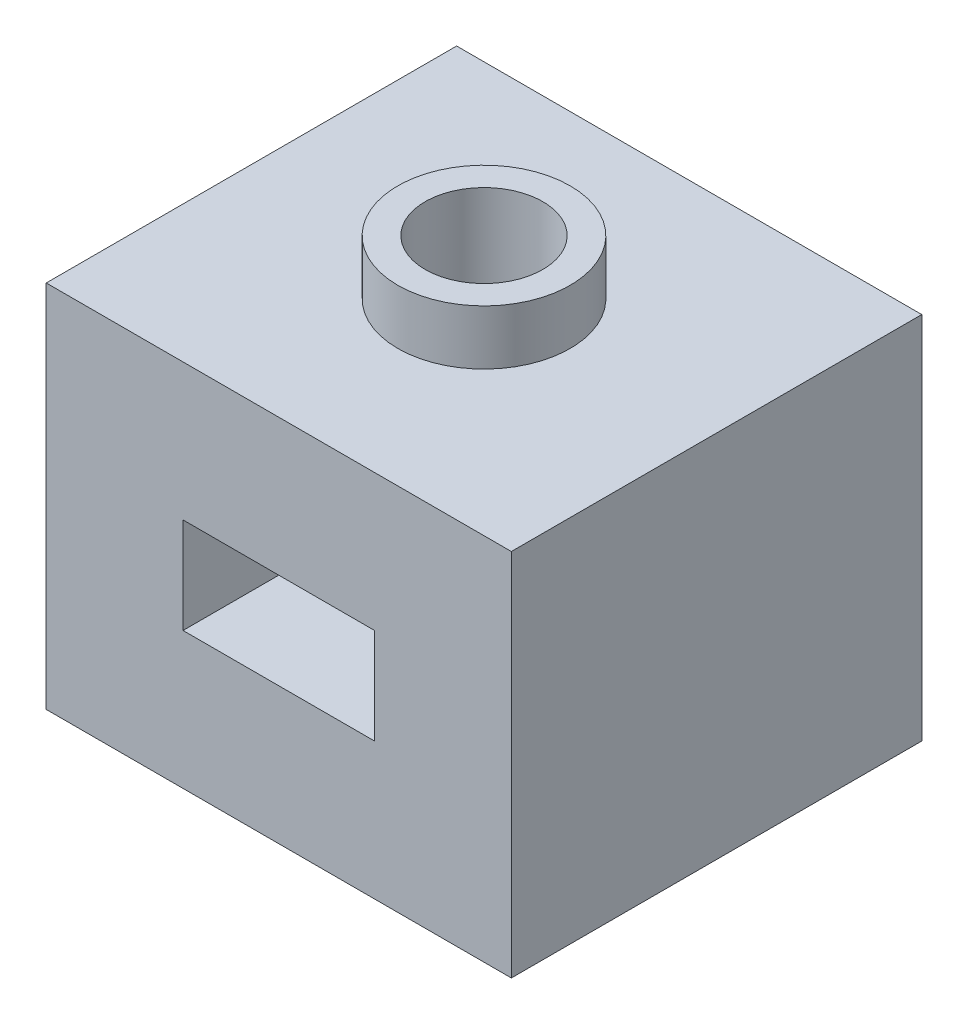
ISO-10303-21;
HEADER;
FILE_DESCRIPTION(('STEP AP214'),'2;1');
FILE_NAME('part.step','',(''),(''),'','','');
FILE_SCHEMA(('AUTOMOTIVE_DESIGN { 1 0 10303 214 1 1 1 1 }'));
ENDSEC;
DATA;
#1=APPLICATION_CONTEXT('core data for automotive mechanical design processes');
#2=APPLICATION_PROTOCOL_DEFINITION('international standard','automotive_design',2000,#1);
#3=PRODUCT_CONTEXT('',#1,'mechanical');
#4=PRODUCT('Part','Part','',(#3));
#5=PRODUCT_RELATED_PRODUCT_CATEGORY('part','',(#4));
#6=PRODUCT_DEFINITION_FORMATION('','',#4);
#7=PRODUCT_DEFINITION_CONTEXT('part definition',#1,'design');
#8=PRODUCT_DEFINITION('design','',#6,#7);
#9=PRODUCT_DEFINITION_SHAPE('','',#8);
#10=(LENGTH_UNIT() NAMED_UNIT(*) SI_UNIT(.MILLI.,.METRE.));
#11=(NAMED_UNIT(*) PLANE_ANGLE_UNIT() SI_UNIT($,.RADIAN.));
#12=(NAMED_UNIT(*) SI_UNIT($,.STERADIAN.) SOLID_ANGLE_UNIT());
#13=UNCERTAINTY_MEASURE_WITH_UNIT(LENGTH_MEASURE(1.E-05),#10,'distance_accuracy_value','');
#14=(GEOMETRIC_REPRESENTATION_CONTEXT(3) GLOBAL_UNCERTAINTY_ASSIGNED_CONTEXT((#13)) GLOBAL_UNIT_ASSIGNED_CONTEXT((#10,
#11,#12)) REPRESENTATION_CONTEXT('',''));
#15=CARTESIAN_POINT('',(0.,0.,0.));
#16=DIRECTION('',(0.,0.,1.));
#17=DIRECTION('',(1.,0.,0.));
#18=AXIS2_PLACEMENT_3D('',#15,#16,#17);
#19=CARTESIAN_POINT('',(0.,0.,15.));
#20=DIRECTION('',(0.,0.,-1.));
#21=DIRECTION('',(-1.,0.,0.));
#22=AXIS2_PLACEMENT_3D('',#19,#20,#21);
#23=PLANE('',#22);
#24=DIRECTION('',(-1.,0.,0.));
#25=VECTOR('',#24,1.);
#26=CARTESIAN_POINT('',(-8.5,6.75,15.));
#27=LINE('',#26,#25);
#28=CARTESIAN_POINT('',(8.5,6.75,15.));
#29=VERTEX_POINT('',#28);
#30=CARTESIAN_POINT('',(-8.5,6.75,15.));
#31=VERTEX_POINT('',#30);
#32=EDGE_CURVE('E163',#29,#31,#27,.T.);
#33=ORIENTED_EDGE('',*,*,#32,.T.);
#34=DIRECTION('',(0.,-1.,0.));
#35=VECTOR('',#34,1.);
#36=CARTESIAN_POINT('',(-8.5,6.75,15.));
#37=LINE('',#36,#35);
#38=CARTESIAN_POINT('',(-8.5,-6.75,15.));
#39=VERTEX_POINT('',#38);
#40=EDGE_CURVE('E167',#31,#39,#37,.T.);
#41=ORIENTED_EDGE('',*,*,#40,.T.);
#42=DIRECTION('',(1.,0.,0.));
#43=VECTOR('',#42,1.);
#44=CARTESIAN_POINT('',(-8.5,-6.75,15.));
#45=LINE('',#44,#43);
#46=CARTESIAN_POINT('',(8.5,-6.75,15.));
#47=VERTEX_POINT('',#46);
#48=EDGE_CURVE('E171',#39,#47,#45,.T.);
#49=ORIENTED_EDGE('',*,*,#48,.T.);
#50=DIRECTION('',(0.,1.,0.));
#51=VECTOR('',#50,1.);
#52=CARTESIAN_POINT('',(8.5,6.75,15.));
#53=LINE('',#52,#51);
#54=EDGE_CURVE('E174',#47,#29,#53,.T.);
#55=ORIENTED_EDGE('',*,*,#54,.T.);
#56=EDGE_LOOP('',(#33,#41,#49,#55));
#57=FACE_BOUND('',#56,.T.);
#58=DIRECTION('',(0.,1.,0.));
#59=VECTOR('',#58,1.);
#60=CARTESIAN_POINT('',(3.5,1.75,15.));
#61=LINE('',#60,#59);
#62=CARTESIAN_POINT('',(3.5,-1.75,15.));
#63=VERTEX_POINT('',#62);
#64=CARTESIAN_POINT('',(3.5,1.75,15.));
#65=VERTEX_POINT('',#64);
#66=EDGE_CURVE('E113',#63,#65,#61,.T.);
#67=ORIENTED_EDGE('',*,*,#66,.F.);
#68=DIRECTION('',(1.,0.,0.));
#69=VECTOR('',#68,1.);
#70=CARTESIAN_POINT('',(-3.5,-1.75,15.));
#71=LINE('',#70,#69);
#72=CARTESIAN_POINT('',(-3.5,-1.75,15.));
#73=VERTEX_POINT('',#72);
#74=EDGE_CURVE('E139',#73,#63,#71,.T.);
#75=ORIENTED_EDGE('',*,*,#74,.F.);
#76=DIRECTION('',(0.,-1.,0.));
#77=VECTOR('',#76,1.);
#78=CARTESIAN_POINT('',(-3.5,1.75,15.));
#79=LINE('',#78,#77);
#80=CARTESIAN_POINT('',(-3.5,1.75,15.));
#81=VERTEX_POINT('',#80);
#82=EDGE_CURVE('E135',#81,#73,#79,.T.);
#83=ORIENTED_EDGE('',*,*,#82,.F.);
#84=DIRECTION('',(-1.,0.,0.));
#85=VECTOR('',#84,1.);
#86=CARTESIAN_POINT('',(-3.5,1.75,15.));
#87=LINE('',#86,#85);
#88=EDGE_CURVE('E122',#65,#81,#87,.T.);
#89=ORIENTED_EDGE('',*,*,#88,.F.);
#90=EDGE_LOOP('',(#67,#75,#83,#89));
#91=FACE_BOUND('',#90,.T.);
#92=ADVANCED_FACE('F47',(#57,#91),#23,.F.);
#93=CARTESIAN_POINT('',(0.,0.,0.));
#94=DIRECTION('',(0.,0.,-1.));
#95=DIRECTION('',(-1.,0.,0.));
#96=AXIS2_PLACEMENT_3D('',#93,#94,#95);
#97=PLANE('',#96);
#98=DIRECTION('',(-1.,0.,0.));
#99=VECTOR('',#98,1.);
#100=CARTESIAN_POINT('',(-8.5,6.75,0.));
#101=LINE('',#100,#99);
#102=CARTESIAN_POINT('',(8.5,6.75,0.));
#103=VERTEX_POINT('',#102);
#104=CARTESIAN_POINT('',(-8.5,6.75,0.));
#105=VERTEX_POINT('',#104);
#106=EDGE_CURVE('E131',#103,#105,#101,.T.);
#107=ORIENTED_EDGE('',*,*,#106,.F.);
#108=DIRECTION('',(0.,1.,0.));
#109=VECTOR('',#108,1.);
#110=CARTESIAN_POINT('',(8.5,6.75,0.));
#111=LINE('',#110,#109);
#112=CARTESIAN_POINT('',(8.5,-6.75,0.));
#113=VERTEX_POINT('',#112);
#114=EDGE_CURVE('E168',#113,#103,#111,.T.);
#115=ORIENTED_EDGE('',*,*,#114,.F.);
#116=DIRECTION('',(1.,0.,0.));
#117=VECTOR('',#116,1.);
#118=CARTESIAN_POINT('',(-8.5,-6.75,0.));
#119=LINE('',#118,#117);
#120=CARTESIAN_POINT('',(-8.5,-6.75,0.));
#121=VERTEX_POINT('',#120);
#122=EDGE_CURVE('E184',#121,#113,#119,.T.);
#123=ORIENTED_EDGE('',*,*,#122,.F.);
#124=DIRECTION('',(0.,-1.,0.));
#125=VECTOR('',#124,1.);
#126=CARTESIAN_POINT('',(-8.5,6.75,0.));
#127=LINE('',#126,#125);
#128=EDGE_CURVE('E181',#105,#121,#127,.T.);
#129=ORIENTED_EDGE('',*,*,#128,.F.);
#130=EDGE_LOOP('',(#107,#115,#123,#129));
#131=FACE_BOUND('',#130,.T.);
#132=DIRECTION('',(1.,0.,0.));
#133=VECTOR('',#132,1.);
#134=CARTESIAN_POINT('',(-3.5,-1.75,0.));
#135=LINE('',#134,#133);
#136=CARTESIAN_POINT('',(-3.5,-1.75,0.));
#137=VERTEX_POINT('',#136);
#138=CARTESIAN_POINT('',(3.5,-1.75,0.));
#139=VERTEX_POINT('',#138);
#140=EDGE_CURVE('E123',#137,#139,#135,.T.);
#141=ORIENTED_EDGE('',*,*,#140,.T.);
#142=DIRECTION('',(0.,1.,0.));
#143=VECTOR('',#142,1.);
#144=CARTESIAN_POINT('',(3.5,1.75,0.));
#145=LINE('',#144,#143);
#146=CARTESIAN_POINT('',(3.5,1.75,0.));
#147=VERTEX_POINT('',#146);
#148=EDGE_CURVE('E71',#139,#147,#145,.T.);
#149=ORIENTED_EDGE('',*,*,#148,.T.);
#150=DIRECTION('',(-1.,0.,0.));
#151=VECTOR('',#150,1.);
#152=CARTESIAN_POINT('',(-3.5,1.75,0.));
#153=LINE('',#152,#151);
#154=CARTESIAN_POINT('',(-3.5,1.75,0.));
#155=VERTEX_POINT('',#154);
#156=EDGE_CURVE('E129',#147,#155,#153,.T.);
#157=ORIENTED_EDGE('',*,*,#156,.T.);
#158=DIRECTION('',(0.,-1.,0.));
#159=VECTOR('',#158,1.);
#160=CARTESIAN_POINT('',(-3.5,1.75,0.));
#161=LINE('',#160,#159);
#162=EDGE_CURVE('E150',#155,#137,#161,.T.);
#163=ORIENTED_EDGE('',*,*,#162,.T.);
#164=EDGE_LOOP('',(#141,#149,#157,#163));
#165=FACE_BOUND('',#164,.T.);
#166=ADVANCED_FACE('F244',(#131,#165),#97,.T.);
#167=CARTESIAN_POINT('',(-8.5,6.75,15.));
#168=DIRECTION('',(0.,-1.,0.));
#169=DIRECTION('',(0.,0.,-1.));
#170=AXIS2_PLACEMENT_3D('',#167,#168,#169);
#171=PLANE('',#170);
#172=CARTESIAN_POINT('',(0.,6.75,7.5));
#173=DIRECTION('',(0.,-1.,0.));
#174=DIRECTION('',(0.,0.,-1.));
#175=AXIS2_PLACEMENT_3D('',#172,#173,#174);
#176=CIRCLE('',#175,3.15);
#177=CARTESIAN_POINT('',(0.,6.75,4.35));
#178=VERTEX_POINT('',#177);
#179=EDGE_CURVE('E11',#178,#178,#176,.F.);
#180=ORIENTED_EDGE('',*,*,#179,.F.);
#181=EDGE_LOOP('',(#180));
#182=FACE_BOUND('',#181,.T.);
#183=ORIENTED_EDGE('',*,*,#106,.T.);
#184=DIRECTION('',(0.,0.,-1.));
#185=VECTOR('',#184,1.);
#186=CARTESIAN_POINT('',(-8.5,6.75,15.));
#187=LINE('',#186,#185);
#188=EDGE_CURVE('E56',#31,#105,#187,.T.);
#189=ORIENTED_EDGE('',*,*,#188,.F.);
#190=ORIENTED_EDGE('',*,*,#32,.F.);
#191=DIRECTION('',(0.,0.,-1.));
#192=VECTOR('',#191,1.);
#193=CARTESIAN_POINT('',(8.5,6.75,15.));
#194=LINE('',#193,#192);
#195=EDGE_CURVE('E177',#29,#103,#194,.T.);
#196=ORIENTED_EDGE('',*,*,#195,.T.);
#197=EDGE_LOOP('',(#183,#189,#190,#196));
#198=FACE_BOUND('',#197,.T.);
#199=ADVANCED_FACE('F49',(#182,#198),#171,.F.);
#200=CARTESIAN_POINT('',(-8.5,6.75,15.));
#201=DIRECTION('',(1.,0.,0.));
#202=DIRECTION('',(0.,1.,0.));
#203=AXIS2_PLACEMENT_3D('',#200,#201,#202);
#204=PLANE('',#203);
#205=ORIENTED_EDGE('',*,*,#128,.T.);
#206=DIRECTION('',(0.,0.,-1.));
#207=VECTOR('',#206,1.);
#208=CARTESIAN_POINT('',(-8.5,-6.75,15.));
#209=LINE('',#208,#207);
#210=EDGE_CURVE('E196',#39,#121,#209,.T.);
#211=ORIENTED_EDGE('',*,*,#210,.F.);
#212=ORIENTED_EDGE('',*,*,#40,.F.);
#213=ORIENTED_EDGE('',*,*,#188,.T.);
#214=EDGE_LOOP('',(#205,#211,#212,#213));
#215=FACE_BOUND('',#214,.T.);
#216=ADVANCED_FACE('F260',(#215),#204,.F.);
#217=CARTESIAN_POINT('',(-8.5,-6.75,15.));
#218=DIRECTION('',(0.,1.,0.));
#219=DIRECTION('',(-1.,0.,0.));
#220=AXIS2_PLACEMENT_3D('',#217,#218,#219);
#221=PLANE('',#220);
#222=CARTESIAN_POINT('',(0.,-6.75,7.5));
#223=DIRECTION('',(0.,1.,0.));
#224=DIRECTION('',(-1.,0.,0.));
#225=AXIS2_PLACEMENT_3D('',#222,#223,#224);
#226=CIRCLE('',#225,2.15);
#227=CARTESIAN_POINT('',(-2.15,-6.75,7.5));
#228=VERTEX_POINT('',#227);
#229=EDGE_CURVE('E147',#228,#228,#226,.T.);
#230=ORIENTED_EDGE('',*,*,#229,.T.);
#231=EDGE_LOOP('',(#230));
#232=FACE_BOUND('',#231,.T.);
#233=ORIENTED_EDGE('',*,*,#122,.T.);
#234=DIRECTION('',(0.,0.,-1.));
#235=VECTOR('',#234,1.);
#236=CARTESIAN_POINT('',(8.5,-6.75,15.));
#237=LINE('',#236,#235);
#238=EDGE_CURVE('E192',#47,#113,#237,.T.);
#239=ORIENTED_EDGE('',*,*,#238,.F.);
#240=ORIENTED_EDGE('',*,*,#48,.F.);
#241=ORIENTED_EDGE('',*,*,#210,.T.);
#242=EDGE_LOOP('',(#233,#239,#240,#241));
#243=FACE_BOUND('',#242,.T.);
#244=ADVANCED_FACE('F225',(#232,#243),#221,.F.);
#245=CARTESIAN_POINT('',(8.5,6.75,15.));
#246=DIRECTION('',(-1.,0.,0.));
#247=DIRECTION('',(0.,-1.,0.));
#248=AXIS2_PLACEMENT_3D('',#245,#246,#247);
#249=PLANE('',#248);
#250=ORIENTED_EDGE('',*,*,#114,.T.);
#251=ORIENTED_EDGE('',*,*,#195,.F.);
#252=ORIENTED_EDGE('',*,*,#54,.F.);
#253=ORIENTED_EDGE('',*,*,#238,.T.);
#254=EDGE_LOOP('',(#250,#251,#252,#253));
#255=FACE_BOUND('',#254,.T.);
#256=ADVANCED_FACE('F255',(#255),#249,.F.);
#257=CARTESIAN_POINT('',(3.5,1.75,15.));
#258=DIRECTION('',(-1.,0.,0.));
#259=DIRECTION('',(0.,-1.,0.));
#260=AXIS2_PLACEMENT_3D('',#257,#258,#259);
#261=PLANE('',#260);
#262=ORIENTED_EDGE('',*,*,#148,.F.);
#263=DIRECTION('',(0.,0.,-1.));
#264=VECTOR('',#263,1.);
#265=CARTESIAN_POINT('',(3.5,-1.75,15.));
#266=LINE('',#265,#264);
#267=EDGE_CURVE('E117',#63,#139,#266,.T.);
#268=ORIENTED_EDGE('',*,*,#267,.F.);
#269=ORIENTED_EDGE('',*,*,#66,.T.);
#270=DIRECTION('',(0.,0.,-1.));
#271=VECTOR('',#270,1.);
#272=CARTESIAN_POINT('',(3.5,1.75,15.));
#273=LINE('',#272,#271);
#274=EDGE_CURVE('E116',#65,#147,#273,.T.);
#275=ORIENTED_EDGE('',*,*,#274,.T.);
#276=EDGE_LOOP('',(#262,#268,#269,#275));
#277=FACE_BOUND('',#276,.T.);
#278=ADVANCED_FACE('F115',(#277),#261,.T.);
#279=CARTESIAN_POINT('',(-3.5,1.75,15.));
#280=DIRECTION('',(0.,-1.,0.));
#281=DIRECTION('',(0.,0.,-1.));
#282=AXIS2_PLACEMENT_3D('',#279,#280,#281);
#283=PLANE('',#282);
#284=CARTESIAN_POINT('',(0.,1.75,7.5));
#285=DIRECTION('',(0.,-1.,0.));
#286=DIRECTION('',(0.,0.,-1.));
#287=AXIS2_PLACEMENT_3D('',#284,#285,#286);
#288=CIRCLE('',#287,2.15);
#289=CARTESIAN_POINT('',(0.,1.75,5.35));
#290=VERTEX_POINT('',#289);
#291=EDGE_CURVE('E205',#290,#290,#288,.T.);
#292=ORIENTED_EDGE('',*,*,#291,.F.);
#293=EDGE_LOOP('',(#292));
#294=FACE_BOUND('',#293,.T.);
#295=ORIENTED_EDGE('',*,*,#156,.F.);
#296=ORIENTED_EDGE('',*,*,#274,.F.);
#297=ORIENTED_EDGE('',*,*,#88,.T.);
#298=DIRECTION('',(0.,0.,-1.));
#299=VECTOR('',#298,1.);
#300=CARTESIAN_POINT('',(-3.5,1.75,15.));
#301=LINE('',#300,#299);
#302=EDGE_CURVE('E132',#81,#155,#301,.T.);
#303=ORIENTED_EDGE('',*,*,#302,.T.);
#304=EDGE_LOOP('',(#295,#296,#297,#303));
#305=FACE_BOUND('',#304,.T.);
#306=ADVANCED_FACE('F126',(#294,#305),#283,.T.);
#307=CARTESIAN_POINT('',(-3.5,1.75,15.));
#308=DIRECTION('',(1.,0.,0.));
#309=DIRECTION('',(0.,0.,-1.));
#310=AXIS2_PLACEMENT_3D('',#307,#308,#309);
#311=PLANE('',#310);
#312=ORIENTED_EDGE('',*,*,#162,.F.);
#313=ORIENTED_EDGE('',*,*,#302,.F.);
#314=ORIENTED_EDGE('',*,*,#82,.T.);
#315=DIRECTION('',(0.,0.,-1.));
#316=VECTOR('',#315,1.);
#317=CARTESIAN_POINT('',(-3.5,-1.75,15.));
#318=LINE('',#317,#316);
#319=EDGE_CURVE('E63',#73,#137,#318,.T.);
#320=ORIENTED_EDGE('',*,*,#319,.T.);
#321=EDGE_LOOP('',(#312,#313,#314,#320));
#322=FACE_BOUND('',#321,.T.);
#323=ADVANCED_FACE('F239',(#322),#311,.T.);
#324=CARTESIAN_POINT('',(-3.5,-1.75,15.));
#325=DIRECTION('',(0.,1.,0.));
#326=DIRECTION('',(0.,0.,1.));
#327=AXIS2_PLACEMENT_3D('',#324,#325,#326);
#328=PLANE('',#327);
#329=CARTESIAN_POINT('',(0.,-1.75,7.5));
#330=DIRECTION('',(0.,1.,0.));
#331=DIRECTION('',(0.,0.,1.));
#332=AXIS2_PLACEMENT_3D('',#329,#330,#331);
#333=CIRCLE('',#332,2.15);
#334=CARTESIAN_POINT('',(0.,-1.75,9.65));
#335=VERTEX_POINT('',#334);
#336=EDGE_CURVE('E202',#335,#335,#333,.T.);
#337=ORIENTED_EDGE('',*,*,#336,.F.);
#338=EDGE_LOOP('',(#337));
#339=FACE_BOUND('',#338,.T.);
#340=ORIENTED_EDGE('',*,*,#140,.F.);
#341=ORIENTED_EDGE('',*,*,#319,.F.);
#342=ORIENTED_EDGE('',*,*,#74,.T.);
#343=ORIENTED_EDGE('',*,*,#267,.T.);
#344=EDGE_LOOP('',(#340,#341,#342,#343));
#345=FACE_BOUND('',#344,.T.);
#346=ADVANCED_FACE('F231',(#339,#345),#328,.T.);
#347=CARTESIAN_POINT('',(0.,-8.25,7.5));
#348=DIRECTION('',(0.,1.,0.));
#349=DIRECTION('',(0.,0.,1.));
#350=AXIS2_PLACEMENT_3D('',#347,#348,#349);
#351=CYLINDRICAL_SURFACE('',#350,2.15);
#352=ORIENTED_EDGE('',*,*,#336,.T.);
#353=EDGE_LOOP('',(#352));
#354=FACE_BOUND('',#353,.T.);
#355=ORIENTED_EDGE('',*,*,#229,.F.);
#356=EDGE_LOOP('',(#355));
#357=FACE_BOUND('',#356,.T.);
#358=ADVANCED_FACE('F228',(#354,#357),#351,.F.);
#359=ORIENTED_EDGE('',*,*,#291,.T.);
#360=EDGE_LOOP('',(#359));
#361=FACE_BOUND('',#360,.T.);
#362=CARTESIAN_POINT('',(0.,8.75,7.5));
#363=DIRECTION('',(0.,1.,0.));
#364=DIRECTION('',(0.,0.,1.));
#365=AXIS2_PLACEMENT_3D('',#362,#363,#364);
#366=CIRCLE('',#365,2.15);
#367=CARTESIAN_POINT('',(0.,8.75,9.65));
#368=VERTEX_POINT('',#367);
#369=EDGE_CURVE('E214',#368,#368,#366,.F.);
#370=ORIENTED_EDGE('',*,*,#369,.F.);
#371=EDGE_LOOP('',(#370));
#372=FACE_BOUND('',#371,.T.);
#373=ADVANCED_FACE('F230',(#361,#372),#351,.F.);
#374=CARTESIAN_POINT('',(0.,8.75,7.5));
#375=DIRECTION('',(0.,-1.,0.));
#376=DIRECTION('',(0.,0.,-1.));
#377=AXIS2_PLACEMENT_3D('',#374,#375,#376);
#378=CYLINDRICAL_SURFACE('',#377,3.15);
#379=CARTESIAN_POINT('',(0.,8.75,7.5));
#380=DIRECTION('',(0.,1.,0.));
#381=DIRECTION('',(0.,0.,1.));
#382=AXIS2_PLACEMENT_3D('',#379,#380,#381);
#383=CIRCLE('',#382,3.15);
#384=CARTESIAN_POINT('',(0.,8.75,10.65));
#385=VERTEX_POINT('',#384);
#386=EDGE_CURVE('E206',#385,#385,#383,.T.);
#387=ORIENTED_EDGE('',*,*,#386,.F.);
#388=EDGE_LOOP('',(#387));
#389=FACE_BOUND('',#388,.T.);
#390=ORIENTED_EDGE('',*,*,#179,.T.);
#391=EDGE_LOOP('',(#390));
#392=FACE_BOUND('',#391,.T.);
#393=ADVANCED_FACE('F237',(#389,#392),#378,.T.);
#394=CARTESIAN_POINT('',(0.,8.75,0.));
#395=DIRECTION('',(0.,1.,0.));
#396=DIRECTION('',(0.,0.,1.));
#397=AXIS2_PLACEMENT_3D('',#394,#395,#396);
#398=PLANE('',#397);
#399=ORIENTED_EDGE('',*,*,#369,.T.);
#400=EDGE_LOOP('',(#399));
#401=FACE_BOUND('',#400,.T.);
#402=ORIENTED_EDGE('',*,*,#386,.T.);
#403=EDGE_LOOP('',(#402));
#404=FACE_BOUND('',#403,.T.);
#405=ADVANCED_FACE('F294',(#401,#404),#398,.T.);
#406=CLOSED_SHELL('',(#92,#166,#199,#216,#244,#256,#278,#306,#323,#346,#358,#373,#393,#405));
#407=MANIFOLD_SOLID_BREP('B2',#406);
#408=ADVANCED_BREP_SHAPE_REPRESENTATION('',(#18,#407),#14);
#409=SHAPE_DEFINITION_REPRESENTATION(#9,#408);
ENDSEC;
END-ISO-10303-21;
